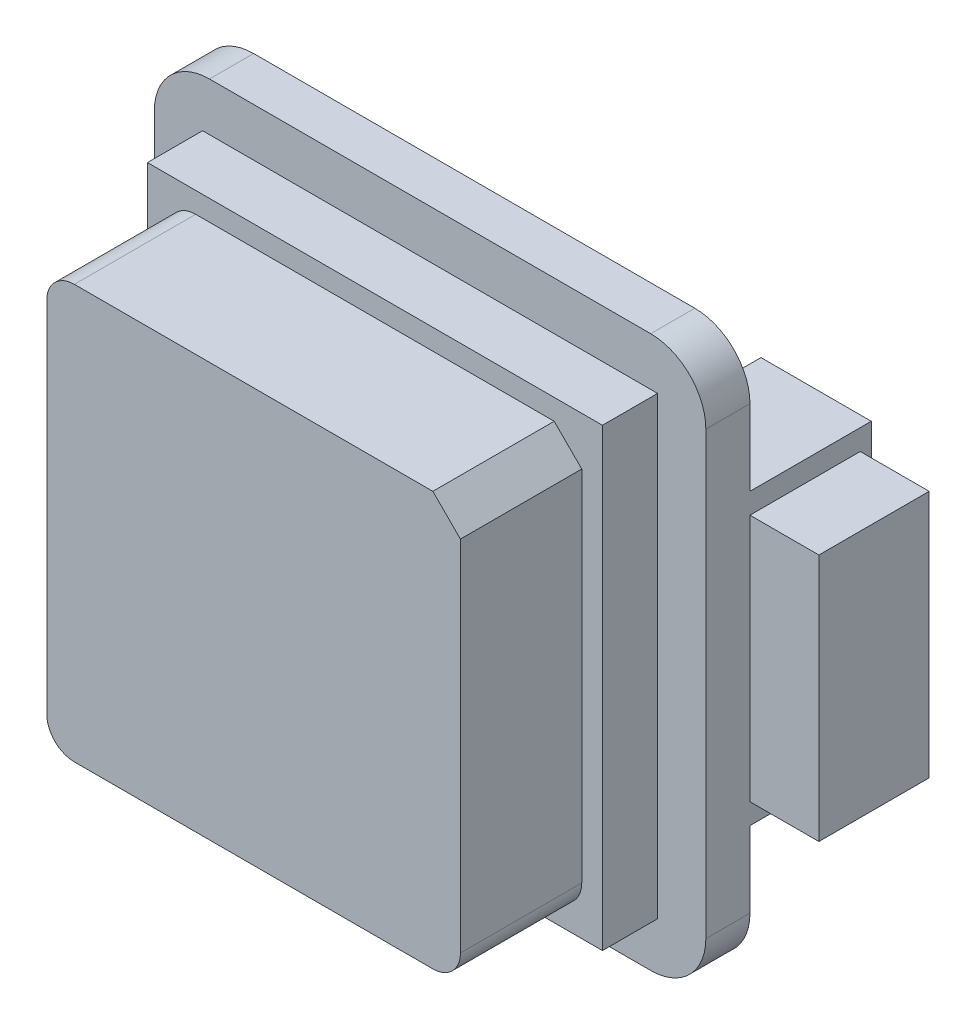
ISO-10303-21;
HEADER;
FILE_DESCRIPTION(('STEP AP214'),'2;1');
FILE_NAME('part.step','',(''),(''),'','','');
FILE_SCHEMA(('AUTOMOTIVE_DESIGN { 1 0 10303 214 1 1 1 1 }'));
ENDSEC;
DATA;
#1=APPLICATION_CONTEXT('core data for automotive mechanical design processes');
#2=APPLICATION_PROTOCOL_DEFINITION('international standard','automotive_design',2000,#1);
#3=PRODUCT_CONTEXT('',#1,'mechanical');
#4=PRODUCT('Part','Part','',(#3));
#5=PRODUCT_RELATED_PRODUCT_CATEGORY('part','',(#4));
#6=PRODUCT_DEFINITION_FORMATION('','',#4);
#7=PRODUCT_DEFINITION_CONTEXT('part definition',#1,'design');
#8=PRODUCT_DEFINITION('design','',#6,#7);
#9=PRODUCT_DEFINITION_SHAPE('','',#8);
#10=(LENGTH_UNIT() NAMED_UNIT(*) SI_UNIT(.MILLI.,.METRE.));
#11=(NAMED_UNIT(*) PLANE_ANGLE_UNIT() SI_UNIT($,.RADIAN.));
#12=(NAMED_UNIT(*) SI_UNIT($,.STERADIAN.) SOLID_ANGLE_UNIT());
#13=UNCERTAINTY_MEASURE_WITH_UNIT(LENGTH_MEASURE(1.E-05),#10,'distance_accuracy_value','');
#14=(GEOMETRIC_REPRESENTATION_CONTEXT(3) GLOBAL_UNCERTAINTY_ASSIGNED_CONTEXT((#13)) GLOBAL_UNIT_ASSIGNED_CONTEXT((#10,
#11,#12)) REPRESENTATION_CONTEXT('',''));
#15=CARTESIAN_POINT('',(0.,0.,0.));
#16=DIRECTION('',(0.,0.,1.));
#17=DIRECTION('',(1.,0.,0.));
#18=AXIS2_PLACEMENT_3D('',#15,#16,#17);
#19=CARTESIAN_POINT('',(8.,8.,0.));
#20=DIRECTION('',(0.,0.,1.));
#21=DIRECTION('',(1.,0.,0.));
#22=AXIS2_PLACEMENT_3D('',#19,#20,#21);
#23=PLANE('',#22);
#24=DIRECTION('',(-1.,0.,0.));
#25=VECTOR('',#24,1.);
#26=CARTESIAN_POINT('',(-10.,-5.25,0.));
#27=LINE('',#26,#25);
#28=CARTESIAN_POINT('',(-6.,-5.25,0.));
#29=VERTEX_POINT('',#28);
#30=CARTESIAN_POINT('',(-10.,-5.25,0.));
#31=VERTEX_POINT('',#30);
#32=EDGE_CURVE('E63',#29,#31,#27,.T.);
#33=ORIENTED_EDGE('',*,*,#32,.F.);
#34=DIRECTION('',(0.,-1.,0.));
#35=VECTOR('',#34,1.);
#36=CARTESIAN_POINT('',(-6.,-5.25,0.));
#37=LINE('',#36,#35);
#38=CARTESIAN_POINT('',(-6.,5.25,0.));
#39=VERTEX_POINT('',#38);
#40=EDGE_CURVE('E305',#39,#29,#37,.T.);
#41=ORIENTED_EDGE('',*,*,#40,.F.);
#42=DIRECTION('',(1.,0.,0.));
#43=VECTOR('',#42,1.);
#44=CARTESIAN_POINT('',(-10.,5.25,0.));
#45=LINE('',#44,#43);
#46=CARTESIAN_POINT('',(-10.,5.25,0.));
#47=VERTEX_POINT('',#46);
#48=EDGE_CURVE('E298',#47,#39,#45,.T.);
#49=ORIENTED_EDGE('',*,*,#48,.F.);
#50=DIRECTION('',(0.,-1.,0.));
#51=VECTOR('',#50,1.);
#52=CARTESIAN_POINT('',(-10.,-7.99999999999998,0.));
#53=LINE('',#52,#51);
#54=CARTESIAN_POINT('',(-10.,7.99999999999999,0.));
#55=VERTEX_POINT('',#54);
#56=EDGE_CURVE('E480',#55,#47,#53,.T.);
#57=ORIENTED_EDGE('',*,*,#56,.F.);
#58=CARTESIAN_POINT('',(-8.,8.,0.));
#59=DIRECTION('',(0.,0.,1.));
#60=DIRECTION('',(-1.,0.,0.));
#61=AXIS2_PLACEMENT_3D('',#58,#59,#60);
#62=CIRCLE('',#61,2.);
#63=CARTESIAN_POINT('',(-7.99999999999999,10.,0.));
#64=VERTEX_POINT('',#63);
#65=EDGE_CURVE('E475',#64,#55,#62,.T.);
#66=ORIENTED_EDGE('',*,*,#65,.F.);
#67=DIRECTION('',(-1.,0.,0.));
#68=VECTOR('',#67,1.);
#69=CARTESIAN_POINT('',(-7.99999999999999,10.,0.));
#70=LINE('',#69,#68);
#71=CARTESIAN_POINT('',(7.99999999999999,10.,0.));
#72=VERTEX_POINT('',#71);
#73=EDGE_CURVE('E472',#72,#64,#70,.T.);
#74=ORIENTED_EDGE('',*,*,#73,.F.);
#75=CARTESIAN_POINT('',(8.,8.,0.));
#76=DIRECTION('',(0.,0.,1.));
#77=DIRECTION('',(1.,0.,0.));
#78=AXIS2_PLACEMENT_3D('',#75,#76,#77);
#79=CIRCLE('',#78,2.);
#80=CARTESIAN_POINT('',(10.,7.99999999999999,0.));
#81=VERTEX_POINT('',#80);
#82=EDGE_CURVE('E449',#81,#72,#79,.T.);
#83=ORIENTED_EDGE('',*,*,#82,.F.);
#84=DIRECTION('',(0.,1.,0.));
#85=VECTOR('',#84,1.);
#86=CARTESIAN_POINT('',(10.,-7.99999999999998,0.));
#87=LINE('',#86,#85);
#88=CARTESIAN_POINT('',(10.,5.25,0.));
#89=VERTEX_POINT('',#88);
#90=EDGE_CURVE('E486',#89,#81,#87,.T.);
#91=ORIENTED_EDGE('',*,*,#90,.F.);
#92=DIRECTION('',(1.,0.,0.));
#93=VECTOR('',#92,1.);
#94=CARTESIAN_POINT('',(10.,5.25,0.));
#95=LINE('',#94,#93);
#96=CARTESIAN_POINT('',(6.,5.25,0.));
#97=VERTEX_POINT('',#96);
#98=EDGE_CURVE('E329',#97,#89,#95,.T.);
#99=ORIENTED_EDGE('',*,*,#98,.F.);
#100=DIRECTION('',(0.,1.,0.));
#101=VECTOR('',#100,1.);
#102=CARTESIAN_POINT('',(6.,-5.25,0.));
#103=LINE('',#102,#101);
#104=CARTESIAN_POINT('',(6.,-5.25,0.));
#105=VERTEX_POINT('',#104);
#106=EDGE_CURVE('E334',#105,#97,#103,.T.);
#107=ORIENTED_EDGE('',*,*,#106,.F.);
#108=DIRECTION('',(-1.,0.,0.));
#109=VECTOR('',#108,1.);
#110=CARTESIAN_POINT('',(10.,-5.25,0.));
#111=LINE('',#110,#109);
#112=CARTESIAN_POINT('',(10.,-5.25,0.));
#113=VERTEX_POINT('',#112);
#114=EDGE_CURVE('E303',#113,#105,#111,.T.);
#115=ORIENTED_EDGE('',*,*,#114,.F.);
#116=CARTESIAN_POINT('',(10.,-7.99999999999998,0.));
#117=VERTEX_POINT('',#116);
#118=EDGE_CURVE('E454',#117,#113,#87,.T.);
#119=ORIENTED_EDGE('',*,*,#118,.F.);
#120=CARTESIAN_POINT('',(8.,-8.,0.));
#121=DIRECTION('',(0.,0.,1.));
#122=DIRECTION('',(1.,0.,0.));
#123=AXIS2_PLACEMENT_3D('',#120,#121,#122);
#124=CIRCLE('',#123,2.);
#125=CARTESIAN_POINT('',(7.99999999999999,-10.,0.));
#126=VERTEX_POINT('',#125);
#127=EDGE_CURVE('E482',#126,#117,#124,.T.);
#128=ORIENTED_EDGE('',*,*,#127,.F.);
#129=DIRECTION('',(1.,0.,0.));
#130=VECTOR('',#129,1.);
#131=CARTESIAN_POINT('',(-7.99999999999999,-10.,0.));
#132=LINE('',#131,#130);
#133=CARTESIAN_POINT('',(-7.99999999999999,-10.,0.));
#134=VERTEX_POINT('',#133);
#135=EDGE_CURVE('E485',#134,#126,#132,.T.);
#136=ORIENTED_EDGE('',*,*,#135,.F.);
#137=CARTESIAN_POINT('',(-8.,-8.,0.));
#138=DIRECTION('',(0.,0.,1.));
#139=DIRECTION('',(1.,0.,0.));
#140=AXIS2_PLACEMENT_3D('',#137,#138,#139);
#141=CIRCLE('',#140,2.);
#142=CARTESIAN_POINT('',(-10.,-7.99999999999998,0.));
#143=VERTEX_POINT('',#142);
#144=EDGE_CURVE('E477',#143,#134,#141,.T.);
#145=ORIENTED_EDGE('',*,*,#144,.F.);
#146=EDGE_CURVE('E478',#31,#143,#53,.T.);
#147=ORIENTED_EDGE('',*,*,#146,.F.);
#148=EDGE_LOOP('',(#33,#41,#49,#57,#66,#74,#83,#91,#99,#107,#115,#119,#128,#136,#145,#147));
#149=FACE_BOUND('',#148,.T.);
#150=ADVANCED_FACE('F41',(#149),#23,.F.);
#151=CARTESIAN_POINT('',(8.,8.,1.6));
#152=DIRECTION('',(0.,0.,-1.));
#153=DIRECTION('',(-1.,0.,0.));
#154=AXIS2_PLACEMENT_3D('',#151,#152,#153);
#155=CYLINDRICAL_SURFACE('',#154,2.);
#156=ORIENTED_EDGE('',*,*,#82,.T.);
#157=DIRECTION('',(0.,0.,-1.));
#158=VECTOR('',#157,1.);
#159=CARTESIAN_POINT('',(7.99999999999999,10.,1.6));
#160=LINE('',#159,#158);
#161=CARTESIAN_POINT('',(7.99999999999999,10.,1.6));
#162=VERTEX_POINT('',#161);
#163=EDGE_CURVE('E12',#162,#72,#160,.T.);
#164=ORIENTED_EDGE('',*,*,#163,.F.);
#165=CARTESIAN_POINT('',(8.,8.,1.6));
#166=DIRECTION('',(0.,0.,1.));
#167=DIRECTION('',(1.,0.,0.));
#168=AXIS2_PLACEMENT_3D('',#165,#166,#167);
#169=CIRCLE('',#168,2.);
#170=CARTESIAN_POINT('',(10.,7.99999999999999,1.6));
#171=VERTEX_POINT('',#170);
#172=EDGE_CURVE('E451',#171,#162,#169,.T.);
#173=ORIENTED_EDGE('',*,*,#172,.F.);
#174=DIRECTION('',(0.,0.,-1.));
#175=VECTOR('',#174,1.);
#176=CARTESIAN_POINT('',(10.,7.99999999999999,1.6));
#177=LINE('',#176,#175);
#178=EDGE_CURVE('E467',#171,#81,#177,.T.);
#179=ORIENTED_EDGE('',*,*,#178,.T.);
#180=EDGE_LOOP('',(#156,#164,#173,#179));
#181=FACE_BOUND('',#180,.T.);
#182=ADVANCED_FACE('F43',(#181),#155,.T.);
#183=CARTESIAN_POINT('',(-7.99999999999999,10.,1.6));
#184=DIRECTION('',(0.,-1.,0.));
#185=DIRECTION('',(1.,0.,0.));
#186=AXIS2_PLACEMENT_3D('',#183,#184,#185);
#187=PLANE('',#186);
#188=ORIENTED_EDGE('',*,*,#73,.T.);
#189=DIRECTION('',(0.,0.,-1.));
#190=VECTOR('',#189,1.);
#191=CARTESIAN_POINT('',(-7.99999999999999,10.,1.6));
#192=LINE('',#191,#190);
#193=CARTESIAN_POINT('',(-7.99999999999999,10.,1.6));
#194=VERTEX_POINT('',#193);
#195=EDGE_CURVE('E47',#194,#64,#192,.T.);
#196=ORIENTED_EDGE('',*,*,#195,.F.);
#197=DIRECTION('',(-1.,0.,0.));
#198=VECTOR('',#197,1.);
#199=CARTESIAN_POINT('',(-7.99999999999999,10.,1.6));
#200=LINE('',#199,#198);
#201=EDGE_CURVE('E452',#162,#194,#200,.T.);
#202=ORIENTED_EDGE('',*,*,#201,.F.);
#203=ORIENTED_EDGE('',*,*,#163,.T.);
#204=EDGE_LOOP('',(#188,#196,#202,#203));
#205=FACE_BOUND('',#204,.T.);
#206=ADVANCED_FACE('F549',(#205),#187,.F.);
#207=CARTESIAN_POINT('',(-8.,8.,1.6));
#208=DIRECTION('',(0.,0.,-1.));
#209=DIRECTION('',(-1.,0.,0.));
#210=AXIS2_PLACEMENT_3D('',#207,#208,#209);
#211=CYLINDRICAL_SURFACE('',#210,2.);
#212=ORIENTED_EDGE('',*,*,#65,.T.);
#213=DIRECTION('',(0.,0.,-1.));
#214=VECTOR('',#213,1.);
#215=CARTESIAN_POINT('',(-10.,7.99999999999999,1.6));
#216=LINE('',#215,#214);
#217=CARTESIAN_POINT('',(-10.,7.99999999999999,1.6));
#218=VERTEX_POINT('',#217);
#219=EDGE_CURVE('E502',#218,#55,#216,.T.);
#220=ORIENTED_EDGE('',*,*,#219,.F.);
#221=CARTESIAN_POINT('',(-8.,8.,1.6));
#222=DIRECTION('',(0.,0.,1.));
#223=DIRECTION('',(-1.,0.,0.));
#224=AXIS2_PLACEMENT_3D('',#221,#222,#223);
#225=CIRCLE('',#224,2.);
#226=EDGE_CURVE('E460',#194,#218,#225,.T.);
#227=ORIENTED_EDGE('',*,*,#226,.F.);
#228=ORIENTED_EDGE('',*,*,#195,.T.);
#229=EDGE_LOOP('',(#212,#220,#227,#228));
#230=FACE_BOUND('',#229,.T.);
#231=ADVANCED_FACE('F509',(#230),#211,.T.);
#232=CARTESIAN_POINT('',(-10.,-7.99999999999998,1.6));
#233=DIRECTION('',(1.,0.,0.));
#234=DIRECTION('',(0.,0.,-1.));
#235=AXIS2_PLACEMENT_3D('',#232,#233,#234);
#236=PLANE('',#235);
#237=ORIENTED_EDGE('',*,*,#56,.T.);
#238=DIRECTION('',(0.,0.,1.));
#239=VECTOR('',#238,1.);
#240=CARTESIAN_POINT('',(-10.,5.25,-4.4));
#241=LINE('',#240,#239);
#242=CARTESIAN_POINT('',(-10.,5.25,-4.4));
#243=VERTEX_POINT('',#242);
#244=EDGE_CURVE('E314',#243,#47,#241,.T.);
#245=ORIENTED_EDGE('',*,*,#244,.F.);
#246=DIRECTION('',(0.,1.,0.));
#247=VECTOR('',#246,1.);
#248=CARTESIAN_POINT('',(-10.,-5.25,-4.4));
#249=LINE('',#248,#247);
#250=CARTESIAN_POINT('',(-10.,-5.25,-4.4));
#251=VERTEX_POINT('',#250);
#252=EDGE_CURVE('E287',#251,#243,#249,.T.);
#253=ORIENTED_EDGE('',*,*,#252,.F.);
#254=DIRECTION('',(0.,0.,1.));
#255=VECTOR('',#254,1.);
#256=CARTESIAN_POINT('',(-10.,-5.25,-4.4));
#257=LINE('',#256,#255);
#258=EDGE_CURVE('E297',#251,#31,#257,.T.);
#259=ORIENTED_EDGE('',*,*,#258,.T.);
#260=ORIENTED_EDGE('',*,*,#146,.T.);
#261=DIRECTION('',(0.,0.,-1.));
#262=VECTOR('',#261,1.);
#263=CARTESIAN_POINT('',(-10.,-7.99999999999998,1.6));
#264=LINE('',#263,#262);
#265=CARTESIAN_POINT('',(-10.,-7.99999999999998,1.6));
#266=VERTEX_POINT('',#265);
#267=EDGE_CURVE('E498',#266,#143,#264,.T.);
#268=ORIENTED_EDGE('',*,*,#267,.F.);
#269=DIRECTION('',(0.,-1.,0.));
#270=VECTOR('',#269,1.);
#271=CARTESIAN_POINT('',(-10.,-7.99999999999998,1.6));
#272=LINE('',#271,#270);
#273=EDGE_CURVE('E459',#218,#266,#272,.T.);
#274=ORIENTED_EDGE('',*,*,#273,.F.);
#275=ORIENTED_EDGE('',*,*,#219,.T.);
#276=EDGE_LOOP('',(#237,#245,#253,#259,#260,#268,#274,#275));
#277=FACE_BOUND('',#276,.T.);
#278=ADVANCED_FACE('F520',(#277),#236,.F.);
#279=CARTESIAN_POINT('',(-8.,-8.,1.6));
#280=DIRECTION('',(0.,0.,-1.));
#281=DIRECTION('',(-1.,0.,0.));
#282=AXIS2_PLACEMENT_3D('',#279,#280,#281);
#283=CYLINDRICAL_SURFACE('',#282,2.);
#284=ORIENTED_EDGE('',*,*,#144,.T.);
#285=DIRECTION('',(0.,0.,-1.));
#286=VECTOR('',#285,1.);
#287=CARTESIAN_POINT('',(-7.99999999999999,-10.,1.6));
#288=LINE('',#287,#286);
#289=CARTESIAN_POINT('',(-7.99999999999999,-10.,1.6));
#290=VERTEX_POINT('',#289);
#291=EDGE_CURVE('E500',#290,#134,#288,.T.);
#292=ORIENTED_EDGE('',*,*,#291,.F.);
#293=CARTESIAN_POINT('',(-8.,-8.,1.6));
#294=DIRECTION('',(0.,0.,1.));
#295=DIRECTION('',(1.,0.,0.));
#296=AXIS2_PLACEMENT_3D('',#293,#294,#295);
#297=CIRCLE('',#296,2.);
#298=EDGE_CURVE('E461',#266,#290,#297,.T.);
#299=ORIENTED_EDGE('',*,*,#298,.F.);
#300=ORIENTED_EDGE('',*,*,#267,.T.);
#301=EDGE_LOOP('',(#284,#292,#299,#300));
#302=FACE_BOUND('',#301,.T.);
#303=ADVANCED_FACE('F570',(#302),#283,.T.);
#304=CARTESIAN_POINT('',(-7.99999999999999,-10.,1.6));
#305=DIRECTION('',(0.,1.,0.));
#306=DIRECTION('',(-1.,0.,0.));
#307=AXIS2_PLACEMENT_3D('',#304,#305,#306);
#308=PLANE('',#307);
#309=ORIENTED_EDGE('',*,*,#135,.T.);
#310=DIRECTION('',(0.,0.,-1.));
#311=VECTOR('',#310,1.);
#312=CARTESIAN_POINT('',(7.99999999999999,-10.,1.6));
#313=LINE('',#312,#311);
#314=CARTESIAN_POINT('',(7.99999999999999,-10.,1.6));
#315=VERTEX_POINT('',#314);
#316=EDGE_CURVE('E493',#315,#126,#313,.T.);
#317=ORIENTED_EDGE('',*,*,#316,.F.);
#318=DIRECTION('',(1.,0.,0.));
#319=VECTOR('',#318,1.);
#320=CARTESIAN_POINT('',(-7.99999999999999,-10.,1.6));
#321=LINE('',#320,#319);
#322=EDGE_CURVE('E462',#290,#315,#321,.T.);
#323=ORIENTED_EDGE('',*,*,#322,.F.);
#324=ORIENTED_EDGE('',*,*,#291,.T.);
#325=EDGE_LOOP('',(#309,#317,#323,#324));
#326=FACE_BOUND('',#325,.T.);
#327=ADVANCED_FACE('F563',(#326),#308,.F.);
#328=CARTESIAN_POINT('',(8.,-8.,1.6));
#329=DIRECTION('',(0.,0.,-1.));
#330=DIRECTION('',(-1.,0.,0.));
#331=AXIS2_PLACEMENT_3D('',#328,#329,#330);
#332=CYLINDRICAL_SURFACE('',#331,2.);
#333=ORIENTED_EDGE('',*,*,#127,.T.);
#334=DIRECTION('',(0.,0.,-1.));
#335=VECTOR('',#334,1.);
#336=CARTESIAN_POINT('',(10.,-7.99999999999998,1.6));
#337=LINE('',#336,#335);
#338=CARTESIAN_POINT('',(10.,-7.99999999999998,1.6));
#339=VERTEX_POINT('',#338);
#340=EDGE_CURVE('E491',#339,#117,#337,.T.);
#341=ORIENTED_EDGE('',*,*,#340,.F.);
#342=CARTESIAN_POINT('',(8.,-8.,1.6));
#343=DIRECTION('',(0.,0.,1.));
#344=DIRECTION('',(1.,0.,0.));
#345=AXIS2_PLACEMENT_3D('',#342,#343,#344);
#346=CIRCLE('',#345,2.);
#347=EDGE_CURVE('E464',#315,#339,#346,.T.);
#348=ORIENTED_EDGE('',*,*,#347,.F.);
#349=ORIENTED_EDGE('',*,*,#316,.T.);
#350=EDGE_LOOP('',(#333,#341,#348,#349));
#351=FACE_BOUND('',#350,.T.);
#352=ADVANCED_FACE('F558',(#351),#332,.T.);
#353=CARTESIAN_POINT('',(10.,-7.99999999999998,1.6));
#354=DIRECTION('',(-1.,0.,0.));
#355=DIRECTION('',(0.,0.,1.));
#356=AXIS2_PLACEMENT_3D('',#353,#354,#355);
#357=PLANE('',#356);
#358=DIRECTION('',(0.,-1.,0.));
#359=VECTOR('',#358,1.);
#360=CARTESIAN_POINT('',(10.,4.5,-4.));
#361=LINE('',#360,#359);
#362=CARTESIAN_POINT('',(10.,4.5,-4.));
#363=VERTEX_POINT('',#362);
#364=CARTESIAN_POINT('',(10.,-4.5,-4.));
#365=VERTEX_POINT('',#364);
#366=EDGE_CURVE('E273',#363,#365,#361,.T.);
#367=ORIENTED_EDGE('',*,*,#366,.T.);
#368=DIRECTION('',(0.,0.,1.));
#369=VECTOR('',#368,1.);
#370=CARTESIAN_POINT('',(10.,-4.5,0.));
#371=LINE('',#370,#369);
#372=CARTESIAN_POINT('',(10.,-4.5,0.));
#373=VERTEX_POINT('',#372);
#374=EDGE_CURVE('E57',#365,#373,#371,.T.);
#375=ORIENTED_EDGE('',*,*,#374,.T.);
#376=DIRECTION('',(0.,1.,0.));
#377=VECTOR('',#376,1.);
#378=CARTESIAN_POINT('',(10.,4.5,0.));
#379=LINE('',#378,#377);
#380=CARTESIAN_POINT('',(10.,4.5,0.));
#381=VERTEX_POINT('',#380);
#382=EDGE_CURVE('E823',#373,#381,#379,.T.);
#383=ORIENTED_EDGE('',*,*,#382,.T.);
#384=DIRECTION('',(0.,0.,-1.));
#385=VECTOR('',#384,1.);
#386=CARTESIAN_POINT('',(10.,4.5,0.));
#387=LINE('',#386,#385);
#388=EDGE_CURVE('E266',#381,#363,#387,.T.);
#389=ORIENTED_EDGE('',*,*,#388,.T.);
#390=EDGE_LOOP('',(#367,#375,#383,#389));
#391=FACE_BOUND('',#390,.T.);
#392=ORIENTED_EDGE('',*,*,#118,.T.);
#393=DIRECTION('',(0.,0.,1.));
#394=VECTOR('',#393,1.);
#395=CARTESIAN_POINT('',(10.,-5.25,-4.4));
#396=LINE('',#395,#394);
#397=CARTESIAN_POINT('',(10.,-5.25,-4.4));
#398=VERTEX_POINT('',#397);
#399=EDGE_CURVE('E288',#398,#113,#396,.T.);
#400=ORIENTED_EDGE('',*,*,#399,.F.);
#401=DIRECTION('',(0.,-1.,0.));
#402=VECTOR('',#401,1.);
#403=CARTESIAN_POINT('',(10.,-5.25,-4.4));
#404=LINE('',#403,#402);
#405=CARTESIAN_POINT('',(10.,5.25,-4.4));
#406=VERTEX_POINT('',#405);
#407=EDGE_CURVE('E331',#406,#398,#404,.T.);
#408=ORIENTED_EDGE('',*,*,#407,.F.);
#409=DIRECTION('',(0.,0.,1.));
#410=VECTOR('',#409,1.);
#411=CARTESIAN_POINT('',(10.,5.25,-4.4));
#412=LINE('',#411,#410);
#413=EDGE_CURVE('E326',#406,#89,#412,.T.);
#414=ORIENTED_EDGE('',*,*,#413,.T.);
#415=ORIENTED_EDGE('',*,*,#90,.T.);
#416=ORIENTED_EDGE('',*,*,#178,.F.);
#417=DIRECTION('',(0.,1.,0.));
#418=VECTOR('',#417,1.);
#419=CARTESIAN_POINT('',(10.,-7.99999999999998,1.6));
#420=LINE('',#419,#418);
#421=EDGE_CURVE('E470',#339,#171,#420,.T.);
#422=ORIENTED_EDGE('',*,*,#421,.F.);
#423=ORIENTED_EDGE('',*,*,#340,.T.);
#424=EDGE_LOOP('',(#392,#400,#408,#414,#415,#416,#422,#423));
#425=FACE_BOUND('',#424,.T.);
#426=ADVANCED_FACE('F556',(#391,#425),#357,.F.);
#427=CARTESIAN_POINT('',(8.,8.,1.6));
#428=DIRECTION('',(0.,0.,1.));
#429=DIRECTION('',(1.,0.,0.));
#430=AXIS2_PLACEMENT_3D('',#427,#428,#429);
#431=PLANE('',#430);
#432=DIRECTION('',(0.,1.,0.));
#433=VECTOR('',#432,1.);
#434=CARTESIAN_POINT('',(8.25,8.25,1.6));
#435=LINE('',#434,#433);
#436=CARTESIAN_POINT('',(8.25,-8.25,1.6));
#437=VERTEX_POINT('',#436);
#438=CARTESIAN_POINT('',(8.25,8.25,1.6));
#439=VERTEX_POINT('',#438);
#440=EDGE_CURVE('E381',#437,#439,#435,.T.);
#441=ORIENTED_EDGE('',*,*,#440,.F.);
#442=DIRECTION('',(1.,0.,0.));
#443=VECTOR('',#442,1.);
#444=CARTESIAN_POINT('',(-8.25,-8.25,1.6));
#445=LINE('',#444,#443);
#446=CARTESIAN_POINT('',(-8.25,-8.25,1.6));
#447=VERTEX_POINT('',#446);
#448=EDGE_CURVE('E425',#447,#437,#445,.T.);
#449=ORIENTED_EDGE('',*,*,#448,.F.);
#450=DIRECTION('',(0.,-1.,0.));
#451=VECTOR('',#450,1.);
#452=CARTESIAN_POINT('',(-8.25,8.25,1.6));
#453=LINE('',#452,#451);
#454=CARTESIAN_POINT('',(-8.25,8.25,1.6));
#455=VERTEX_POINT('',#454);
#456=EDGE_CURVE('E432',#455,#447,#453,.T.);
#457=ORIENTED_EDGE('',*,*,#456,.F.);
#458=DIRECTION('',(-1.,0.,0.));
#459=VECTOR('',#458,1.);
#460=CARTESIAN_POINT('',(-8.25,8.25,1.6));
#461=LINE('',#460,#459);
#462=EDGE_CURVE('E431',#439,#455,#461,.T.);
#463=ORIENTED_EDGE('',*,*,#462,.F.);
#464=EDGE_LOOP('',(#441,#449,#457,#463));
#465=FACE_BOUND('',#464,.T.);
#466=ORIENTED_EDGE('',*,*,#172,.T.);
#467=ORIENTED_EDGE('',*,*,#201,.T.);
#468=ORIENTED_EDGE('',*,*,#226,.T.);
#469=ORIENTED_EDGE('',*,*,#273,.T.);
#470=ORIENTED_EDGE('',*,*,#298,.T.);
#471=ORIENTED_EDGE('',*,*,#322,.T.);
#472=ORIENTED_EDGE('',*,*,#347,.T.);
#473=ORIENTED_EDGE('',*,*,#421,.T.);
#474=EDGE_LOOP('',(#466,#467,#468,#469,#470,#471,#472,#473));
#475=FACE_BOUND('',#474,.T.);
#476=ADVANCED_FACE('F551',(#465,#475),#431,.T.);
#477=CARTESIAN_POINT('',(8.25,8.25,3.6));
#478=DIRECTION('',(-1.,0.,0.));
#479=DIRECTION('',(0.,-1.,0.));
#480=AXIS2_PLACEMENT_3D('',#477,#478,#479);
#481=PLANE('',#480);
#482=ORIENTED_EDGE('',*,*,#440,.T.);
#483=DIRECTION('',(0.,0.,-1.));
#484=VECTOR('',#483,1.);
#485=CARTESIAN_POINT('',(8.25,8.25,3.6));
#486=LINE('',#485,#484);
#487=CARTESIAN_POINT('',(8.25,8.25,3.6));
#488=VERTEX_POINT('',#487);
#489=EDGE_CURVE('E450',#488,#439,#486,.T.);
#490=ORIENTED_EDGE('',*,*,#489,.F.);
#491=DIRECTION('',(0.,1.,0.));
#492=VECTOR('',#491,1.);
#493=CARTESIAN_POINT('',(8.25,8.25,3.6));
#494=LINE('',#493,#492);
#495=CARTESIAN_POINT('',(8.25,-8.25,3.6));
#496=VERTEX_POINT('',#495);
#497=EDGE_CURVE('E416',#496,#488,#494,.T.);
#498=ORIENTED_EDGE('',*,*,#497,.F.);
#499=DIRECTION('',(0.,0.,-1.));
#500=VECTOR('',#499,1.);
#501=CARTESIAN_POINT('',(8.25,-8.25,3.6));
#502=LINE('',#501,#500);
#503=EDGE_CURVE('E428',#496,#437,#502,.T.);
#504=ORIENTED_EDGE('',*,*,#503,.T.);
#505=EDGE_LOOP('',(#482,#490,#498,#504));
#506=FACE_BOUND('',#505,.T.);
#507=ADVANCED_FACE('F656',(#506),#481,.F.);
#508=CARTESIAN_POINT('',(-8.25,8.25,3.6));
#509=DIRECTION('',(0.,-1.,0.));
#510=DIRECTION('',(0.,0.,-1.));
#511=AXIS2_PLACEMENT_3D('',#508,#509,#510);
#512=PLANE('',#511);
#513=ORIENTED_EDGE('',*,*,#462,.T.);
#514=DIRECTION('',(0.,0.,-1.));
#515=VECTOR('',#514,1.);
#516=CARTESIAN_POINT('',(-8.25,8.25,3.6));
#517=LINE('',#516,#515);
#518=CARTESIAN_POINT('',(-8.25,8.25,3.6));
#519=VERTEX_POINT('',#518);
#520=EDGE_CURVE('E441',#519,#455,#517,.T.);
#521=ORIENTED_EDGE('',*,*,#520,.F.);
#522=DIRECTION('',(-1.,0.,0.));
#523=VECTOR('',#522,1.);
#524=CARTESIAN_POINT('',(-8.25,8.25,3.6));
#525=LINE('',#524,#523);
#526=EDGE_CURVE('E423',#488,#519,#525,.T.);
#527=ORIENTED_EDGE('',*,*,#526,.F.);
#528=ORIENTED_EDGE('',*,*,#489,.T.);
#529=EDGE_LOOP('',(#513,#521,#527,#528));
#530=FACE_BOUND('',#529,.T.);
#531=ADVANCED_FACE('F653',(#530),#512,.F.);
#532=CARTESIAN_POINT('',(-8.25,8.25,3.6));
#533=DIRECTION('',(1.,0.,0.));
#534=DIRECTION('',(0.,0.,-1.));
#535=AXIS2_PLACEMENT_3D('',#532,#533,#534);
#536=PLANE('',#535);
#537=ORIENTED_EDGE('',*,*,#456,.T.);
#538=DIRECTION('',(0.,0.,-1.));
#539=VECTOR('',#538,1.);
#540=CARTESIAN_POINT('',(-8.25,-8.25,3.6));
#541=LINE('',#540,#539);
#542=CARTESIAN_POINT('',(-8.25,-8.25,3.6));
#543=VERTEX_POINT('',#542);
#544=EDGE_CURVE('E442',#543,#447,#541,.T.);
#545=ORIENTED_EDGE('',*,*,#544,.F.);
#546=DIRECTION('',(0.,-1.,0.));
#547=VECTOR('',#546,1.);
#548=CARTESIAN_POINT('',(-8.25,8.25,3.6));
#549=LINE('',#548,#547);
#550=EDGE_CURVE('E424',#519,#543,#549,.T.);
#551=ORIENTED_EDGE('',*,*,#550,.F.);
#552=ORIENTED_EDGE('',*,*,#520,.T.);
#553=EDGE_LOOP('',(#537,#545,#551,#552));
#554=FACE_BOUND('',#553,.T.);
#555=ADVANCED_FACE('F647',(#554),#536,.F.);
#556=CARTESIAN_POINT('',(-8.25,-8.25,3.6));
#557=DIRECTION('',(0.,1.,0.));
#558=DIRECTION('',(0.,0.,1.));
#559=AXIS2_PLACEMENT_3D('',#556,#557,#558);
#560=PLANE('',#559);
#561=ORIENTED_EDGE('',*,*,#448,.T.);
#562=ORIENTED_EDGE('',*,*,#503,.F.);
#563=DIRECTION('',(1.,0.,0.));
#564=VECTOR('',#563,1.);
#565=CARTESIAN_POINT('',(-8.25,-8.25,3.6));
#566=LINE('',#565,#564);
#567=EDGE_CURVE('E426',#543,#496,#566,.T.);
#568=ORIENTED_EDGE('',*,*,#567,.F.);
#569=ORIENTED_EDGE('',*,*,#544,.T.);
#570=EDGE_LOOP('',(#561,#562,#568,#569));
#571=FACE_BOUND('',#570,.T.);
#572=ADVANCED_FACE('F642',(#571),#560,.F.);
#573=CARTESIAN_POINT('',(0.,0.,3.6));
#574=DIRECTION('',(0.,0.,1.));
#575=DIRECTION('',(1.,0.,0.));
#576=AXIS2_PLACEMENT_3D('',#573,#574,#575);
#577=PLANE('',#576);
#578=CARTESIAN_POINT('',(6.5,-6.5,3.6));
#579=DIRECTION('',(0.,0.,1.));
#580=DIRECTION('',(1.,0.,0.));
#581=AXIS2_PLACEMENT_3D('',#578,#579,#580);
#582=CIRCLE('',#581,1.);
#583=CARTESIAN_POINT('',(6.5,-7.5,3.6));
#584=VERTEX_POINT('',#583);
#585=CARTESIAN_POINT('',(7.5,-6.5,3.6));
#586=VERTEX_POINT('',#585);
#587=EDGE_CURVE('E374',#584,#586,#582,.T.);
#588=ORIENTED_EDGE('',*,*,#587,.F.);
#589=DIRECTION('',(1.,0.,0.));
#590=VECTOR('',#589,1.);
#591=CARTESIAN_POINT('',(-6.5,-7.5,3.6));
#592=LINE('',#591,#590);
#593=CARTESIAN_POINT('',(-6.5,-7.5,3.6));
#594=VERTEX_POINT('',#593);
#595=EDGE_CURVE('E347',#594,#584,#592,.T.);
#596=ORIENTED_EDGE('',*,*,#595,.F.);
#597=CARTESIAN_POINT('',(-6.5,-6.5,3.6));
#598=DIRECTION('',(0.,0.,1.));
#599=DIRECTION('',(1.,0.,0.));
#600=AXIS2_PLACEMENT_3D('',#597,#598,#599);
#601=CIRCLE('',#600,1.);
#602=CARTESIAN_POINT('',(-7.5,-6.5,3.6));
#603=VERTEX_POINT('',#602);
#604=EDGE_CURVE('E351',#603,#594,#601,.T.);
#605=ORIENTED_EDGE('',*,*,#604,.F.);
#606=DIRECTION('',(0.,-1.,0.));
#607=VECTOR('',#606,1.);
#608=CARTESIAN_POINT('',(-7.5,6.5,3.6));
#609=LINE('',#608,#607);
#610=CARTESIAN_POINT('',(-7.5,6.5,3.6));
#611=VERTEX_POINT('',#610);
#612=EDGE_CURVE('E354',#611,#603,#609,.T.);
#613=ORIENTED_EDGE('',*,*,#612,.F.);
#614=CARTESIAN_POINT('',(-6.5,6.5,3.6));
#615=DIRECTION('',(0.,0.,1.));
#616=DIRECTION('',(1.,0.,0.));
#617=AXIS2_PLACEMENT_3D('',#614,#615,#616);
#618=CIRCLE('',#617,1.);
#619=CARTESIAN_POINT('',(-6.5,7.5,3.6));
#620=VERTEX_POINT('',#619);
#621=EDGE_CURVE('E357',#620,#611,#618,.T.);
#622=ORIENTED_EDGE('',*,*,#621,.F.);
#623=DIRECTION('',(-1.,0.,0.));
#624=VECTOR('',#623,1.);
#625=CARTESIAN_POINT('',(-6.5,7.5,3.6));
#626=LINE('',#625,#624);
#627=CARTESIAN_POINT('',(6.5,7.5,3.6));
#628=VERTEX_POINT('',#627);
#629=EDGE_CURVE('E361',#628,#620,#626,.T.);
#630=ORIENTED_EDGE('',*,*,#629,.F.);
#631=DIRECTION('',(-0.707106781186548,0.707106781186548,0.));
#632=VECTOR('',#631,1.);
#633=CARTESIAN_POINT('',(6.5,7.5,3.6));
#634=LINE('',#633,#632);
#635=CARTESIAN_POINT('',(7.5,6.5,3.6));
#636=VERTEX_POINT('',#635);
#637=EDGE_CURVE('E370',#636,#628,#634,.T.);
#638=ORIENTED_EDGE('',*,*,#637,.F.);
#639=DIRECTION('',(0.,1.,0.));
#640=VECTOR('',#639,1.);
#641=CARTESIAN_POINT('',(7.5,6.5,3.6));
#642=LINE('',#641,#640);
#643=EDGE_CURVE('E371',#586,#636,#642,.T.);
#644=ORIENTED_EDGE('',*,*,#643,.F.);
#645=EDGE_LOOP('',(#588,#596,#605,#613,#622,#630,#638,#644));
#646=FACE_BOUND('',#645,.T.);
#647=ORIENTED_EDGE('',*,*,#497,.T.);
#648=ORIENTED_EDGE('',*,*,#526,.T.);
#649=ORIENTED_EDGE('',*,*,#550,.T.);
#650=ORIENTED_EDGE('',*,*,#567,.T.);
#651=EDGE_LOOP('',(#647,#648,#649,#650));
#652=FACE_BOUND('',#651,.T.);
#653=ADVANCED_FACE('F639',(#646,#652),#577,.T.);
#654=CARTESIAN_POINT('',(6.5,-6.5,37.2132034355964));
#655=DIRECTION('',(0.,0.,-1.));
#656=DIRECTION('',(-1.,0.,0.));
#657=AXIS2_PLACEMENT_3D('',#654,#655,#656);
#658=CYLINDRICAL_SURFACE('',#657,1.);
#659=CARTESIAN_POINT('',(6.5,-6.5,8.));
#660=DIRECTION('',(0.,0.,1.));
#661=DIRECTION('',(1.,0.,0.));
#662=AXIS2_PLACEMENT_3D('',#659,#660,#661);
#663=CIRCLE('',#662,1.);
#664=CARTESIAN_POINT('',(6.5,-7.5,8.));
#665=VERTEX_POINT('',#664);
#666=CARTESIAN_POINT('',(7.5,-6.5,8.));
#667=VERTEX_POINT('',#666);
#668=EDGE_CURVE('E400',#665,#667,#663,.T.);
#669=ORIENTED_EDGE('',*,*,#668,.F.);
#670=DIRECTION('',(0.,0.,-1.));
#671=VECTOR('',#670,1.);
#672=CARTESIAN_POINT('',(6.5,-7.5,37.2132034355964));
#673=LINE('',#672,#671);
#674=EDGE_CURVE('E320',#665,#584,#673,.T.);
#675=ORIENTED_EDGE('',*,*,#674,.T.);
#676=ORIENTED_EDGE('',*,*,#587,.T.);
#677=DIRECTION('',(0.,0.,-1.));
#678=VECTOR('',#677,1.);
#679=CARTESIAN_POINT('',(7.5,-6.5,37.2132034355964));
#680=LINE('',#679,#678);
#681=EDGE_CURVE('E372',#667,#586,#680,.T.);
#682=ORIENTED_EDGE('',*,*,#681,.F.);
#683=EDGE_LOOP('',(#669,#675,#676,#682));
#684=FACE_BOUND('',#683,.T.);
#685=ADVANCED_FACE('F637',(#684),#658,.T.);
#686=CARTESIAN_POINT('',(7.5,6.5,37.2132034355964));
#687=DIRECTION('',(-1.,0.,0.));
#688=DIRECTION('',(0.,-1.,0.));
#689=AXIS2_PLACEMENT_3D('',#686,#687,#688);
#690=PLANE('',#689);
#691=DIRECTION('',(0.,1.,0.));
#692=VECTOR('',#691,1.);
#693=CARTESIAN_POINT('',(7.5,6.5,8.));
#694=LINE('',#693,#692);
#695=CARTESIAN_POINT('',(7.5,6.5,8.));
#696=VERTEX_POINT('',#695);
#697=EDGE_CURVE('E393',#667,#696,#694,.T.);
#698=ORIENTED_EDGE('',*,*,#697,.F.);
#699=ORIENTED_EDGE('',*,*,#681,.T.);
#700=ORIENTED_EDGE('',*,*,#643,.T.);
#701=DIRECTION('',(0.,0.,-1.));
#702=VECTOR('',#701,1.);
#703=CARTESIAN_POINT('',(7.5,6.5,37.2132034355964));
#704=LINE('',#703,#702);
#705=EDGE_CURVE('E367',#696,#636,#704,.T.);
#706=ORIENTED_EDGE('',*,*,#705,.F.);
#707=EDGE_LOOP('',(#698,#699,#700,#706));
#708=FACE_BOUND('',#707,.T.);
#709=ADVANCED_FACE('F633',(#708),#690,.F.);
#710=CARTESIAN_POINT('',(6.5,7.5,37.2132034355964));
#711=DIRECTION('',(-0.707106781186548,-0.707106781186548,0.));
#712=DIRECTION('',(0.707106781186548,-0.707106781186548,0.));
#713=AXIS2_PLACEMENT_3D('',#710,#711,#712);
#714=PLANE('',#713);
#715=DIRECTION('',(-0.707106781186548,0.707106781186548,0.));
#716=VECTOR('',#715,1.);
#717=CARTESIAN_POINT('',(6.5,7.5,8.));
#718=LINE('',#717,#716);
#719=CARTESIAN_POINT('',(6.5,7.5,8.));
#720=VERTEX_POINT('',#719);
#721=EDGE_CURVE('E391',#696,#720,#718,.T.);
#722=ORIENTED_EDGE('',*,*,#721,.F.);
#723=ORIENTED_EDGE('',*,*,#705,.T.);
#724=ORIENTED_EDGE('',*,*,#637,.T.);
#725=DIRECTION('',(0.,0.,-1.));
#726=VECTOR('',#725,1.);
#727=CARTESIAN_POINT('',(6.5,7.5,37.2132034355964));
#728=LINE('',#727,#726);
#729=EDGE_CURVE('E368',#720,#628,#728,.T.);
#730=ORIENTED_EDGE('',*,*,#729,.F.);
#731=EDGE_LOOP('',(#722,#723,#724,#730));
#732=FACE_BOUND('',#731,.T.);
#733=ADVANCED_FACE('F628',(#732),#714,.F.);
#734=CARTESIAN_POINT('',(-6.5,7.5,37.2132034355964));
#735=DIRECTION('',(0.,-1.,0.));
#736=DIRECTION('',(0.,0.,-1.));
#737=AXIS2_PLACEMENT_3D('',#734,#735,#736);
#738=PLANE('',#737);
#739=DIRECTION('',(-1.,0.,0.));
#740=VECTOR('',#739,1.);
#741=CARTESIAN_POINT('',(-6.5,7.5,8.));
#742=LINE('',#741,#740);
#743=CARTESIAN_POINT('',(-6.5,7.5,8.));
#744=VERTEX_POINT('',#743);
#745=EDGE_CURVE('E389',#720,#744,#742,.T.);
#746=ORIENTED_EDGE('',*,*,#745,.F.);
#747=ORIENTED_EDGE('',*,*,#729,.T.);
#748=ORIENTED_EDGE('',*,*,#629,.T.);
#749=DIRECTION('',(0.,0.,-1.));
#750=VECTOR('',#749,1.);
#751=CARTESIAN_POINT('',(-6.5,7.5,37.2132034355964));
#752=LINE('',#751,#750);
#753=EDGE_CURVE('E362',#744,#620,#752,.T.);
#754=ORIENTED_EDGE('',*,*,#753,.F.);
#755=EDGE_LOOP('',(#746,#747,#748,#754));
#756=FACE_BOUND('',#755,.T.);
#757=ADVANCED_FACE('F623',(#756),#738,.F.);
#758=CARTESIAN_POINT('',(-6.5,6.5,37.2132034355964));
#759=DIRECTION('',(0.,0.,-1.));
#760=DIRECTION('',(-1.,0.,0.));
#761=AXIS2_PLACEMENT_3D('',#758,#759,#760);
#762=CYLINDRICAL_SURFACE('',#761,1.);
#763=CARTESIAN_POINT('',(-6.5,6.5,8.));
#764=DIRECTION('',(0.,0.,1.));
#765=DIRECTION('',(1.,0.,0.));
#766=AXIS2_PLACEMENT_3D('',#763,#764,#765);
#767=CIRCLE('',#766,1.);
#768=CARTESIAN_POINT('',(-7.5,6.5,8.));
#769=VERTEX_POINT('',#768);
#770=EDGE_CURVE('E384',#744,#769,#767,.T.);
#771=ORIENTED_EDGE('',*,*,#770,.F.);
#772=ORIENTED_EDGE('',*,*,#753,.T.);
#773=ORIENTED_EDGE('',*,*,#621,.T.);
#774=DIRECTION('',(0.,0.,-1.));
#775=VECTOR('',#774,1.);
#776=CARTESIAN_POINT('',(-7.5,6.5,37.2132034355964));
#777=LINE('',#776,#775);
#778=EDGE_CURVE('E358',#769,#611,#777,.T.);
#779=ORIENTED_EDGE('',*,*,#778,.F.);
#780=EDGE_LOOP('',(#771,#772,#773,#779));
#781=FACE_BOUND('',#780,.T.);
#782=ADVANCED_FACE('F622',(#781),#762,.T.);
#783=CARTESIAN_POINT('',(-7.5,6.5,37.2132034355964));
#784=DIRECTION('',(1.,0.,0.));
#785=DIRECTION('',(0.,1.,0.));
#786=AXIS2_PLACEMENT_3D('',#783,#784,#785);
#787=PLANE('',#786);
#788=DIRECTION('',(0.,-1.,0.));
#789=VECTOR('',#788,1.);
#790=CARTESIAN_POINT('',(-7.5,6.5,8.));
#791=LINE('',#790,#789);
#792=CARTESIAN_POINT('',(-7.5,-6.5,8.));
#793=VERTEX_POINT('',#792);
#794=EDGE_CURVE('E385',#769,#793,#791,.T.);
#795=ORIENTED_EDGE('',*,*,#794,.F.);
#796=ORIENTED_EDGE('',*,*,#778,.T.);
#797=ORIENTED_EDGE('',*,*,#612,.T.);
#798=DIRECTION('',(0.,0.,-1.));
#799=VECTOR('',#798,1.);
#800=CARTESIAN_POINT('',(-7.5,-6.5,37.2132034355964));
#801=LINE('',#800,#799);
#802=EDGE_CURVE('E353',#793,#603,#801,.T.);
#803=ORIENTED_EDGE('',*,*,#802,.F.);
#804=EDGE_LOOP('',(#795,#796,#797,#803));
#805=FACE_BOUND('',#804,.T.);
#806=ADVANCED_FACE('F620',(#805),#787,.F.);
#807=CARTESIAN_POINT('',(-6.5,-6.5,37.2132034355964));
#808=DIRECTION('',(0.,0.,-1.));
#809=DIRECTION('',(-1.,0.,0.));
#810=AXIS2_PLACEMENT_3D('',#807,#808,#809);
#811=CYLINDRICAL_SURFACE('',#810,1.);
#812=CARTESIAN_POINT('',(-6.5,-6.5,8.));
#813=DIRECTION('',(0.,0.,1.));
#814=DIRECTION('',(1.,0.,0.));
#815=AXIS2_PLACEMENT_3D('',#812,#813,#814);
#816=CIRCLE('',#815,1.);
#817=CARTESIAN_POINT('',(-6.5,-7.5,8.));
#818=VERTEX_POINT('',#817);
#819=EDGE_CURVE('E378',#793,#818,#816,.T.);
#820=ORIENTED_EDGE('',*,*,#819,.F.);
#821=ORIENTED_EDGE('',*,*,#802,.T.);
#822=ORIENTED_EDGE('',*,*,#604,.T.);
#823=DIRECTION('',(0.,0.,-1.));
#824=VECTOR('',#823,1.);
#825=CARTESIAN_POINT('',(-6.5,-7.5,37.2132034355964));
#826=LINE('',#825,#824);
#827=EDGE_CURVE('E348',#818,#594,#826,.T.);
#828=ORIENTED_EDGE('',*,*,#827,.F.);
#829=EDGE_LOOP('',(#820,#821,#822,#828));
#830=FACE_BOUND('',#829,.T.);
#831=ADVANCED_FACE('F612',(#830),#811,.T.);
#832=CARTESIAN_POINT('',(-6.5,-7.5,37.2132034355964));
#833=DIRECTION('',(0.,1.,0.));
#834=DIRECTION('',(0.,0.,1.));
#835=AXIS2_PLACEMENT_3D('',#832,#833,#834);
#836=PLANE('',#835);
#837=DIRECTION('',(1.,0.,0.));
#838=VECTOR('',#837,1.);
#839=CARTESIAN_POINT('',(-6.5,-7.5,8.));
#840=LINE('',#839,#838);
#841=EDGE_CURVE('E349',#818,#665,#840,.T.);
#842=ORIENTED_EDGE('',*,*,#841,.F.);
#843=ORIENTED_EDGE('',*,*,#827,.T.);
#844=ORIENTED_EDGE('',*,*,#595,.T.);
#845=ORIENTED_EDGE('',*,*,#674,.F.);
#846=EDGE_LOOP('',(#842,#843,#844,#845));
#847=FACE_BOUND('',#846,.T.);
#848=ADVANCED_FACE('F602',(#847),#836,.F.);
#849=CARTESIAN_POINT('',(8.,8.,8.));
#850=DIRECTION('',(0.,0.,1.));
#851=DIRECTION('',(1.,0.,0.));
#852=AXIS2_PLACEMENT_3D('',#849,#850,#851);
#853=PLANE('',#852);
#854=ORIENTED_EDGE('',*,*,#841,.T.);
#855=ORIENTED_EDGE('',*,*,#668,.T.);
#856=ORIENTED_EDGE('',*,*,#697,.T.);
#857=ORIENTED_EDGE('',*,*,#721,.T.);
#858=ORIENTED_EDGE('',*,*,#745,.T.);
#859=ORIENTED_EDGE('',*,*,#770,.T.);
#860=ORIENTED_EDGE('',*,*,#794,.T.);
#861=ORIENTED_EDGE('',*,*,#819,.T.);
#862=EDGE_LOOP('',(#854,#855,#856,#857,#858,#859,#860,#861));
#863=FACE_BOUND('',#862,.T.);
#864=ADVANCED_FACE('F600',(#863),#853,.T.);
#865=CARTESIAN_POINT('',(10.,-5.25,-4.4));
#866=DIRECTION('',(0.,1.,0.));
#867=DIRECTION('',(0.,0.,1.));
#868=AXIS2_PLACEMENT_3D('',#865,#866,#867);
#869=PLANE('',#868);
#870=ORIENTED_EDGE('',*,*,#114,.T.);
#871=DIRECTION('',(0.,0.,1.));
#872=VECTOR('',#871,1.);
#873=CARTESIAN_POINT('',(6.,-5.25,-4.4));
#874=LINE('',#873,#872);
#875=CARTESIAN_POINT('',(6.,-5.25,-4.4));
#876=VERTEX_POINT('',#875);
#877=EDGE_CURVE('E319',#876,#105,#874,.T.);
#878=ORIENTED_EDGE('',*,*,#877,.F.);
#879=DIRECTION('',(-1.,0.,0.));
#880=VECTOR('',#879,1.);
#881=CARTESIAN_POINT('',(10.,-5.25,-4.4));
#882=LINE('',#881,#880);
#883=EDGE_CURVE('E345',#398,#876,#882,.T.);
#884=ORIENTED_EDGE('',*,*,#883,.F.);
#885=ORIENTED_EDGE('',*,*,#399,.T.);
#886=EDGE_LOOP('',(#870,#878,#884,#885));
#887=FACE_BOUND('',#886,.T.);
#888=ADVANCED_FACE('F594',(#887),#869,.F.);
#889=CARTESIAN_POINT('',(6.,-5.25,-4.4));
#890=DIRECTION('',(1.,0.,0.));
#891=DIRECTION('',(0.,0.,-1.));
#892=AXIS2_PLACEMENT_3D('',#889,#890,#891);
#893=PLANE('',#892);
#894=ORIENTED_EDGE('',*,*,#106,.T.);
#895=DIRECTION('',(0.,0.,1.));
#896=VECTOR('',#895,1.);
#897=CARTESIAN_POINT('',(6.,5.25,-4.4));
#898=LINE('',#897,#896);
#899=CARTESIAN_POINT('',(6.,5.25,-4.4));
#900=VERTEX_POINT('',#899);
#901=EDGE_CURVE('E323',#900,#97,#898,.T.);
#902=ORIENTED_EDGE('',*,*,#901,.F.);
#903=DIRECTION('',(0.,1.,0.));
#904=VECTOR('',#903,1.);
#905=CARTESIAN_POINT('',(6.,-5.25,-4.4));
#906=LINE('',#905,#904);
#907=EDGE_CURVE('E339',#876,#900,#906,.T.);
#908=ORIENTED_EDGE('',*,*,#907,.F.);
#909=ORIENTED_EDGE('',*,*,#877,.T.);
#910=EDGE_LOOP('',(#894,#902,#908,#909));
#911=FACE_BOUND('',#910,.T.);
#912=ADVANCED_FACE('F595',(#911),#893,.F.);
#913=CARTESIAN_POINT('',(10.,5.25,-4.4));
#914=DIRECTION('',(0.,-1.,0.));
#915=DIRECTION('',(0.,0.,-1.));
#916=AXIS2_PLACEMENT_3D('',#913,#914,#915);
#917=PLANE('',#916);
#918=ORIENTED_EDGE('',*,*,#98,.T.);
#919=ORIENTED_EDGE('',*,*,#413,.F.);
#920=DIRECTION('',(1.,0.,0.));
#921=VECTOR('',#920,1.);
#922=CARTESIAN_POINT('',(10.,5.25,-4.4));
#923=LINE('',#922,#921);
#924=EDGE_CURVE('E328',#900,#406,#923,.T.);
#925=ORIENTED_EDGE('',*,*,#924,.F.);
#926=ORIENTED_EDGE('',*,*,#901,.T.);
#927=EDGE_LOOP('',(#918,#919,#925,#926));
#928=FACE_BOUND('',#927,.T.);
#929=ADVANCED_FACE('F581',(#928),#917,.F.);
#930=CARTESIAN_POINT('',(0.,0.,-4.4));
#931=DIRECTION('',(0.,0.,1.));
#932=DIRECTION('',(1.,0.,0.));
#933=AXIS2_PLACEMENT_3D('',#930,#931,#932);
#934=PLANE('',#933);
#935=ORIENTED_EDGE('',*,*,#407,.T.);
#936=ORIENTED_EDGE('',*,*,#883,.T.);
#937=ORIENTED_EDGE('',*,*,#907,.T.);
#938=ORIENTED_EDGE('',*,*,#924,.T.);
#939=EDGE_LOOP('',(#935,#936,#937,#938));
#940=FACE_BOUND('',#939,.T.);
#941=ADVANCED_FACE('F541',(#940),#934,.F.);
#942=CARTESIAN_POINT('',(-10.,5.25,-4.4));
#943=DIRECTION('',(0.,-1.,0.));
#944=DIRECTION('',(0.,0.,-1.));
#945=AXIS2_PLACEMENT_3D('',#942,#943,#944);
#946=PLANE('',#945);
#947=ORIENTED_EDGE('',*,*,#48,.T.);
#948=DIRECTION('',(0.,0.,1.));
#949=VECTOR('',#948,1.);
#950=CARTESIAN_POINT('',(-6.,5.25,-4.4));
#951=LINE('',#950,#949);
#952=CARTESIAN_POINT('',(-6.,5.25,-4.4));
#953=VERTEX_POINT('',#952);
#954=EDGE_CURVE('E313',#953,#39,#951,.T.);
#955=ORIENTED_EDGE('',*,*,#954,.F.);
#956=DIRECTION('',(1.,0.,0.));
#957=VECTOR('',#956,1.);
#958=CARTESIAN_POINT('',(-10.,5.25,-4.4));
#959=LINE('',#958,#957);
#960=EDGE_CURVE('E295',#243,#953,#959,.T.);
#961=ORIENTED_EDGE('',*,*,#960,.F.);
#962=ORIENTED_EDGE('',*,*,#244,.T.);
#963=EDGE_LOOP('',(#947,#955,#961,#962));
#964=FACE_BOUND('',#963,.T.);
#965=ADVANCED_FACE('F521',(#964),#946,.F.);
#966=CARTESIAN_POINT('',(-6.,-5.25,-4.4));
#967=DIRECTION('',(-1.,0.,0.));
#968=DIRECTION('',(0.,0.,1.));
#969=AXIS2_PLACEMENT_3D('',#966,#967,#968);
#970=PLANE('',#969);
#971=ORIENTED_EDGE('',*,*,#40,.T.);
#972=DIRECTION('',(0.,0.,1.));
#973=VECTOR('',#972,1.);
#974=CARTESIAN_POINT('',(-6.,-5.25,-4.4));
#975=LINE('',#974,#973);
#976=CARTESIAN_POINT('',(-6.,-5.25,-4.4));
#977=VERTEX_POINT('',#976);
#978=EDGE_CURVE('E306',#977,#29,#975,.T.);
#979=ORIENTED_EDGE('',*,*,#978,.F.);
#980=DIRECTION('',(0.,-1.,0.));
#981=VECTOR('',#980,1.);
#982=CARTESIAN_POINT('',(-6.,-5.25,-4.4));
#983=LINE('',#982,#981);
#984=EDGE_CURVE('E294',#953,#977,#983,.T.);
#985=ORIENTED_EDGE('',*,*,#984,.F.);
#986=ORIENTED_EDGE('',*,*,#954,.T.);
#987=EDGE_LOOP('',(#971,#979,#985,#986));
#988=FACE_BOUND('',#987,.T.);
#989=ADVANCED_FACE('F531',(#988),#970,.F.);
#990=CARTESIAN_POINT('',(-10.,-5.25,-4.4));
#991=DIRECTION('',(0.,1.,0.));
#992=DIRECTION('',(0.,0.,1.));
#993=AXIS2_PLACEMENT_3D('',#990,#991,#992);
#994=PLANE('',#993);
#995=ORIENTED_EDGE('',*,*,#32,.T.);
#996=ORIENTED_EDGE('',*,*,#258,.F.);
#997=DIRECTION('',(-1.,0.,0.));
#998=VECTOR('',#997,1.);
#999=CARTESIAN_POINT('',(-10.,-5.25,-4.4));
#1000=LINE('',#999,#998);
#1001=EDGE_CURVE('E296',#977,#251,#1000,.T.);
#1002=ORIENTED_EDGE('',*,*,#1001,.F.);
#1003=ORIENTED_EDGE('',*,*,#978,.T.);
#1004=EDGE_LOOP('',(#995,#996,#1002,#1003));
#1005=FACE_BOUND('',#1004,.T.);
#1006=ADVANCED_FACE('F529',(#1005),#994,.F.);
#1007=CARTESIAN_POINT('',(0.,0.,-4.4));
#1008=DIRECTION('',(0.,0.,-1.));
#1009=DIRECTION('',(-1.,0.,0.));
#1010=AXIS2_PLACEMENT_3D('',#1007,#1008,#1009);
#1011=PLANE('',#1010);
#1012=ORIENTED_EDGE('',*,*,#252,.T.);
#1013=ORIENTED_EDGE('',*,*,#960,.T.);
#1014=ORIENTED_EDGE('',*,*,#984,.T.);
#1015=ORIENTED_EDGE('',*,*,#1001,.T.);
#1016=EDGE_LOOP('',(#1012,#1013,#1014,#1015));
#1017=FACE_BOUND('',#1016,.T.);
#1018=ADVANCED_FACE('F524',(#1017),#1011,.T.);
#1019=CARTESIAN_POINT('',(12.5,-7.99999999999998,1.6));
#1020=DIRECTION('',(1.,0.,0.));
#1021=DIRECTION('',(0.,0.,-1.));
#1022=AXIS2_PLACEMENT_3D('',#1019,#1020,#1021);
#1023=PLANE('',#1022);
#1024=DIRECTION('',(0.,0.,1.));
#1025=VECTOR('',#1024,1.);
#1026=CARTESIAN_POINT('',(12.5,-4.5,0.));
#1027=LINE('',#1026,#1025);
#1028=CARTESIAN_POINT('',(12.5,-4.5,-4.));
#1029=VERTEX_POINT('',#1028);
#1030=CARTESIAN_POINT('',(12.5,-4.5,0.));
#1031=VERTEX_POINT('',#1030);
#1032=EDGE_CURVE('E281',#1029,#1031,#1027,.T.);
#1033=ORIENTED_EDGE('',*,*,#1032,.F.);
#1034=DIRECTION('',(0.,-1.,0.));
#1035=VECTOR('',#1034,1.);
#1036=CARTESIAN_POINT('',(12.5,4.5,-4.));
#1037=LINE('',#1036,#1035);
#1038=CARTESIAN_POINT('',(12.5,4.5,-4.));
#1039=VERTEX_POINT('',#1038);
#1040=EDGE_CURVE('E260',#1039,#1029,#1037,.T.);
#1041=ORIENTED_EDGE('',*,*,#1040,.F.);
#1042=DIRECTION('',(0.,0.,-1.));
#1043=VECTOR('',#1042,1.);
#1044=CARTESIAN_POINT('',(12.5,4.5,0.));
#1045=LINE('',#1044,#1043);
#1046=CARTESIAN_POINT('',(12.5,4.5,0.));
#1047=VERTEX_POINT('',#1046);
#1048=EDGE_CURVE('E249',#1047,#1039,#1045,.T.);
#1049=ORIENTED_EDGE('',*,*,#1048,.F.);
#1050=DIRECTION('',(0.,1.,0.));
#1051=VECTOR('',#1050,1.);
#1052=CARTESIAN_POINT('',(12.5,4.5,0.));
#1053=LINE('',#1052,#1051);
#1054=EDGE_CURVE('E255',#1031,#1047,#1053,.T.);
#1055=ORIENTED_EDGE('',*,*,#1054,.F.);
#1056=EDGE_LOOP('',(#1033,#1041,#1049,#1055));
#1057=FACE_BOUND('',#1056,.T.);
#1058=ADVANCED_FACE('F252',(#1057),#1023,.T.);
#1059=CARTESIAN_POINT('',(44.8488578017961,4.5,0.));
#1060=DIRECTION('',(0.,0.,1.));
#1061=DIRECTION('',(1.,0.,0.));
#1062=AXIS2_PLACEMENT_3D('',#1059,#1060,#1061);
#1063=PLANE('',#1062);
#1064=DIRECTION('',(-1.,0.,0.));
#1065=VECTOR('',#1064,1.);
#1066=CARTESIAN_POINT('',(44.8488578017961,-4.5,0.));
#1067=LINE('',#1066,#1065);
#1068=EDGE_CURVE('E272',#1031,#373,#1067,.T.);
#1069=ORIENTED_EDGE('',*,*,#1068,.F.);
#1070=ORIENTED_EDGE('',*,*,#1054,.T.);
#1071=DIRECTION('',(-1.,0.,0.));
#1072=VECTOR('',#1071,1.);
#1073=CARTESIAN_POINT('',(44.8488578017961,4.5,0.));
#1074=LINE('',#1073,#1072);
#1075=EDGE_CURVE('E261',#1047,#381,#1074,.T.);
#1076=ORIENTED_EDGE('',*,*,#1075,.T.);
#1077=ORIENTED_EDGE('',*,*,#382,.F.);
#1078=EDGE_LOOP('',(#1069,#1070,#1076,#1077));
#1079=FACE_BOUND('',#1078,.T.);
#1080=ADVANCED_FACE('F275',(#1079),#1063,.T.);
#1081=CARTESIAN_POINT('',(44.8488578017961,4.5,0.));
#1082=DIRECTION('',(0.,1.,0.));
#1083=DIRECTION('',(0.,0.,1.));
#1084=AXIS2_PLACEMENT_3D('',#1081,#1082,#1083);
#1085=PLANE('',#1084);
#1086=ORIENTED_EDGE('',*,*,#1075,.F.);
#1087=ORIENTED_EDGE('',*,*,#1048,.T.);
#1088=DIRECTION('',(-1.,0.,0.));
#1089=VECTOR('',#1088,1.);
#1090=CARTESIAN_POINT('',(44.8488578017961,4.5,-4.));
#1091=LINE('',#1090,#1089);
#1092=EDGE_CURVE('E257',#1039,#363,#1091,.T.);
#1093=ORIENTED_EDGE('',*,*,#1092,.T.);
#1094=ORIENTED_EDGE('',*,*,#388,.F.);
#1095=EDGE_LOOP('',(#1086,#1087,#1093,#1094));
#1096=FACE_BOUND('',#1095,.T.);
#1097=ADVANCED_FACE('F262',(#1096),#1085,.T.);
#1098=CARTESIAN_POINT('',(44.8488578017961,4.5,-4.));
#1099=DIRECTION('',(0.,0.,-1.));
#1100=DIRECTION('',(-1.,0.,0.));
#1101=AXIS2_PLACEMENT_3D('',#1098,#1099,#1100);
#1102=PLANE('',#1101);
#1103=ORIENTED_EDGE('',*,*,#1092,.F.);
#1104=ORIENTED_EDGE('',*,*,#1040,.T.);
#1105=DIRECTION('',(-1.,0.,0.));
#1106=VECTOR('',#1105,1.);
#1107=CARTESIAN_POINT('',(44.8488578017961,-4.5,-4.));
#1108=LINE('',#1107,#1106);
#1109=EDGE_CURVE('E282',#1029,#365,#1108,.T.);
#1110=ORIENTED_EDGE('',*,*,#1109,.T.);
#1111=ORIENTED_EDGE('',*,*,#366,.F.);
#1112=EDGE_LOOP('',(#1103,#1104,#1110,#1111));
#1113=FACE_BOUND('',#1112,.T.);
#1114=ADVANCED_FACE('F802',(#1113),#1102,.T.);
#1115=CARTESIAN_POINT('',(44.8488578017961,-4.5,0.));
#1116=DIRECTION('',(0.,-1.,0.));
#1117=DIRECTION('',(0.,0.,-1.));
#1118=AXIS2_PLACEMENT_3D('',#1115,#1116,#1117);
#1119=PLANE('',#1118);
#1120=ORIENTED_EDGE('',*,*,#1109,.F.);
#1121=ORIENTED_EDGE('',*,*,#1032,.T.);
#1122=ORIENTED_EDGE('',*,*,#1068,.T.);
#1123=ORIENTED_EDGE('',*,*,#374,.F.);
#1124=EDGE_LOOP('',(#1120,#1121,#1122,#1123));
#1125=FACE_BOUND('',#1124,.T.);
#1126=ADVANCED_FACE('F811',(#1125),#1119,.T.);
#1127=CLOSED_SHELL('',(#150,#182,#206,#231,#278,#303,#327,#352,#426,#476,#507,#531,#555,#572,
#653,#685,#709,#733,#757,#782,#806,#831,#848,#864,#888,#912,#929,#941,#965,#989,#1006,#1018,
#1058,#1080,#1097,#1114,#1126));
#1128=MANIFOLD_SOLID_BREP('B2',#1127);
#1129=ADVANCED_BREP_SHAPE_REPRESENTATION('',(#18,#1128),#14);
#1130=SHAPE_DEFINITION_REPRESENTATION(#9,#1129);
ENDSEC;
END-ISO-10303-21;
